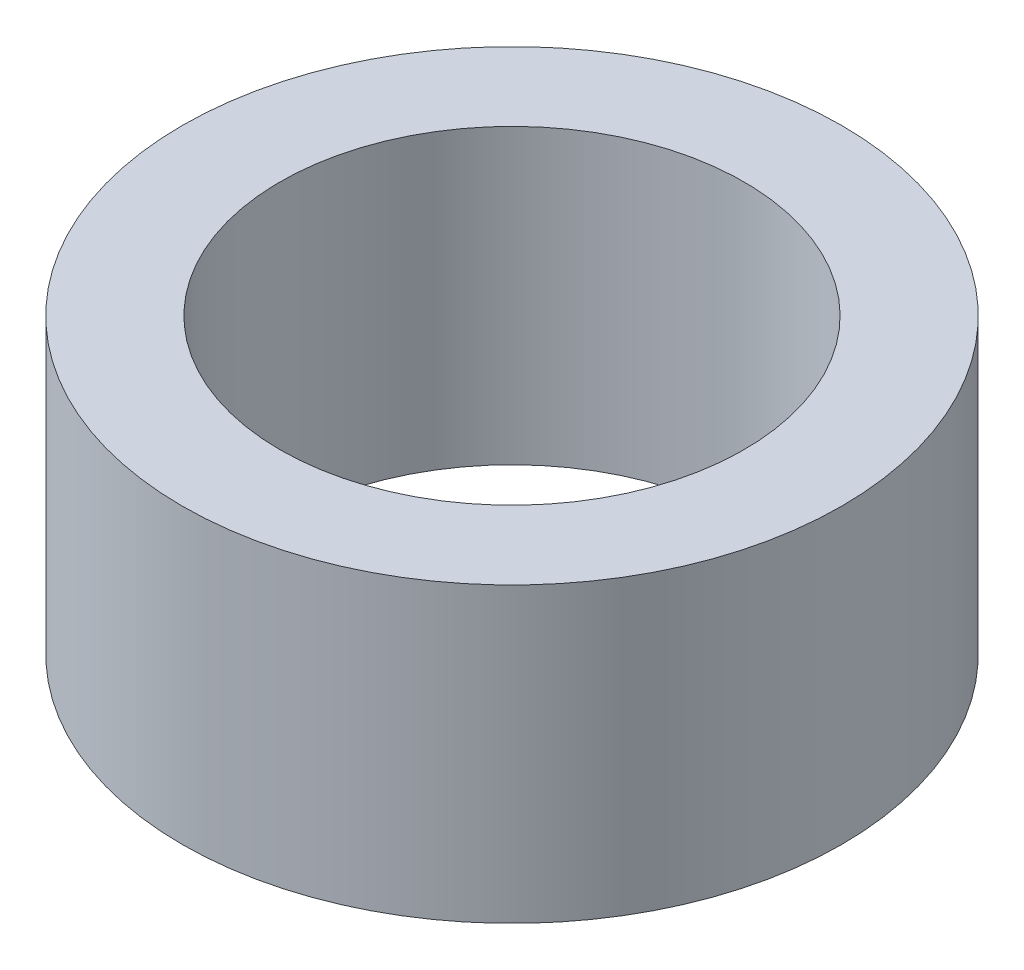
ISO-10303-21;
HEADER;
FILE_DESCRIPTION(('STEP AP214'),'2;1');
FILE_NAME('part.step','',(''),(''),'','','');
FILE_SCHEMA(('AUTOMOTIVE_DESIGN { 1 0 10303 214 1 1 1 1 }'));
ENDSEC;
DATA;
#1=APPLICATION_CONTEXT('core data for automotive mechanical design processes');
#2=APPLICATION_PROTOCOL_DEFINITION('international standard','automotive_design',2000,#1);
#3=PRODUCT_CONTEXT('',#1,'mechanical');
#4=PRODUCT('Part','Part','',(#3));
#5=PRODUCT_RELATED_PRODUCT_CATEGORY('part','',(#4));
#6=PRODUCT_DEFINITION_FORMATION('','',#4);
#7=PRODUCT_DEFINITION_CONTEXT('part definition',#1,'design');
#8=PRODUCT_DEFINITION('design','',#6,#7);
#9=PRODUCT_DEFINITION_SHAPE('','',#8);
#10=(LENGTH_UNIT() NAMED_UNIT(*) SI_UNIT(.MILLI.,.METRE.));
#11=(NAMED_UNIT(*) PLANE_ANGLE_UNIT() SI_UNIT($,.RADIAN.));
#12=(NAMED_UNIT(*) SI_UNIT($,.STERADIAN.) SOLID_ANGLE_UNIT());
#13=UNCERTAINTY_MEASURE_WITH_UNIT(LENGTH_MEASURE(1.E-05),#10,'distance_accuracy_value','');
#14=(GEOMETRIC_REPRESENTATION_CONTEXT(3) GLOBAL_UNCERTAINTY_ASSIGNED_CONTEXT((#13)) GLOBAL_UNIT_ASSIGNED_CONTEXT((#10,
#11,#12)) REPRESENTATION_CONTEXT('',''));
#15=CARTESIAN_POINT('',(0.,0.,0.));
#16=DIRECTION('',(0.,0.,1.));
#17=DIRECTION('',(1.,0.,0.));
#18=AXIS2_PLACEMENT_3D('',#15,#16,#17);
#19=CARTESIAN_POINT('',(0.,7.,0.));
#20=DIRECTION('',(0.,1.,0.));
#21=DIRECTION('',(0.,0.,1.));
#22=AXIS2_PLACEMENT_3D('',#19,#20,#21);
#23=CYLINDRICAL_SURFACE('',#22,4.75);
#24=CARTESIAN_POINT('',(0.,4.,0.));
#25=DIRECTION('',(0.,1.,0.));
#26=DIRECTION('',(0.,0.,1.));
#27=AXIS2_PLACEMENT_3D('',#24,#25,#26);
#28=CIRCLE('',#27,4.75);
#29=CARTESIAN_POINT('',(0.,4.,4.75));
#30=VERTEX_POINT('',#29);
#31=EDGE_CURVE('E26',#30,#30,#28,.T.);
#32=ORIENTED_EDGE('',*,*,#31,.F.);
#33=EDGE_LOOP('',(#32));
#34=FACE_BOUND('',#33,.T.);
#35=CARTESIAN_POINT('',(0.,10.,0.));
#36=DIRECTION('',(0.,1.,0.));
#37=DIRECTION('',(0.,0.,1.));
#38=AXIS2_PLACEMENT_3D('',#35,#36,#37);
#39=CIRCLE('',#38,4.75);
#40=CARTESIAN_POINT('',(0.,10.,4.75));
#41=VERTEX_POINT('',#40);
#42=EDGE_CURVE('E17',#41,#41,#39,.F.);
#43=ORIENTED_EDGE('',*,*,#42,.F.);
#44=EDGE_LOOP('',(#43));
#45=FACE_BOUND('',#44,.T.);
#46=ADVANCED_FACE('F14',(#34,#45),#23,.F.);
#47=CARTESIAN_POINT('',(0.,10.,0.));
#48=DIRECTION('',(0.,1.,0.));
#49=DIRECTION('',(0.,0.,1.));
#50=AXIS2_PLACEMENT_3D('',#47,#48,#49);
#51=PLANE('',#50);
#52=CARTESIAN_POINT('',(0.,10.,0.));
#53=DIRECTION('',(0.,1.,0.));
#54=DIRECTION('',(0.,0.,1.));
#55=AXIS2_PLACEMENT_3D('',#52,#53,#54);
#56=CIRCLE('',#55,6.75);
#57=CARTESIAN_POINT('',(0.,10.,6.75));
#58=VERTEX_POINT('',#57);
#59=EDGE_CURVE('E21',#58,#58,#56,.F.);
#60=ORIENTED_EDGE('',*,*,#59,.F.);
#61=EDGE_LOOP('',(#60));
#62=FACE_BOUND('',#61,.T.);
#63=ORIENTED_EDGE('',*,*,#42,.T.);
#64=EDGE_LOOP('',(#63));
#65=FACE_BOUND('',#64,.T.);
#66=ADVANCED_FACE('F34',(#62,#65),#51,.T.);
#67=CARTESIAN_POINT('',(0.,4.,0.));
#68=DIRECTION('',(0.,-1.,0.));
#69=DIRECTION('',(0.,0.,-1.));
#70=AXIS2_PLACEMENT_3D('',#67,#68,#69);
#71=PLANE('',#70);
#72=CARTESIAN_POINT('',(0.,4.,0.));
#73=DIRECTION('',(0.,1.,0.));
#74=DIRECTION('',(0.,0.,1.));
#75=AXIS2_PLACEMENT_3D('',#72,#73,#74);
#76=CIRCLE('',#75,6.75);
#77=CARTESIAN_POINT('',(0.,4.,6.75));
#78=VERTEX_POINT('',#77);
#79=EDGE_CURVE('E10',#78,#78,#76,.T.);
#80=ORIENTED_EDGE('',*,*,#79,.F.);
#81=EDGE_LOOP('',(#80));
#82=FACE_BOUND('',#81,.T.);
#83=ORIENTED_EDGE('',*,*,#31,.T.);
#84=EDGE_LOOP('',(#83));
#85=FACE_BOUND('',#84,.T.);
#86=ADVANCED_FACE('F42',(#82,#85),#71,.T.);
#87=CARTESIAN_POINT('',(0.,7.,0.));
#88=DIRECTION('',(0.,1.,0.));
#89=DIRECTION('',(0.,0.,1.));
#90=AXIS2_PLACEMENT_3D('',#87,#88,#89);
#91=CYLINDRICAL_SURFACE('',#90,6.75);
#92=ORIENTED_EDGE('',*,*,#59,.T.);
#93=EDGE_LOOP('',(#92));
#94=FACE_BOUND('',#93,.T.);
#95=ORIENTED_EDGE('',*,*,#79,.T.);
#96=EDGE_LOOP('',(#95));
#97=FACE_BOUND('',#96,.T.);
#98=ADVANCED_FACE('F44',(#94,#97),#91,.T.);
#99=CLOSED_SHELL('',(#46,#66,#86,#98));
#100=MANIFOLD_SOLID_BREP('B1',#99);
#101=ADVANCED_BREP_SHAPE_REPRESENTATION('',(#18,#100),#14);
#102=SHAPE_DEFINITION_REPRESENTATION(#9,#101);
ENDSEC;
END-ISO-10303-21;
